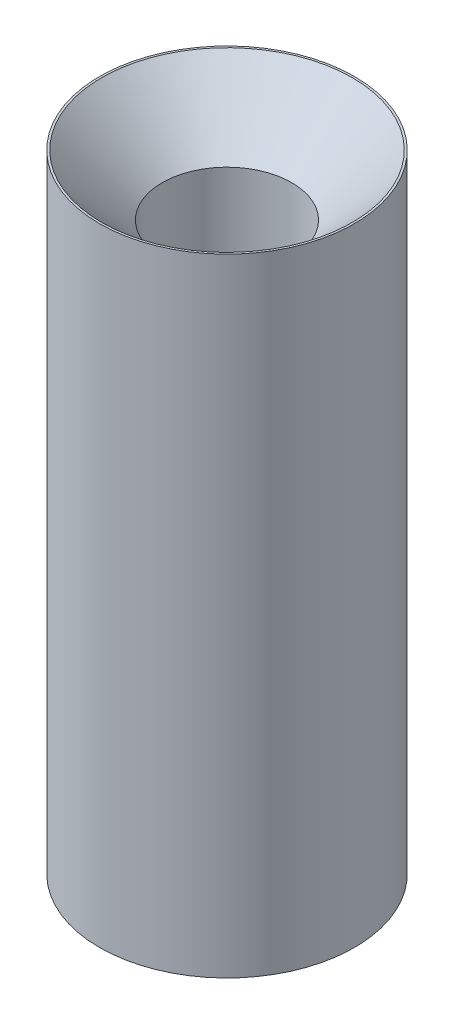
ISO-10303-21;
HEADER;
FILE_DESCRIPTION(('STEP AP214'),'2;1');
FILE_NAME('part.step','',(''),(''),'','','');
FILE_SCHEMA(('AUTOMOTIVE_DESIGN { 1 0 10303 214 1 1 1 1 }'));
ENDSEC;
DATA;
#1=APPLICATION_CONTEXT('core data for automotive mechanical design processes');
#2=APPLICATION_PROTOCOL_DEFINITION('international standard','automotive_design',2000,#1);
#3=PRODUCT_CONTEXT('',#1,'mechanical');
#4=PRODUCT('Part','Part','',(#3));
#5=PRODUCT_RELATED_PRODUCT_CATEGORY('part','',(#4));
#6=PRODUCT_DEFINITION_FORMATION('','',#4);
#7=PRODUCT_DEFINITION_CONTEXT('part definition',#1,'design');
#8=PRODUCT_DEFINITION('design','',#6,#7);
#9=PRODUCT_DEFINITION_SHAPE('','',#8);
#10=(LENGTH_UNIT() NAMED_UNIT(*) SI_UNIT(.MILLI.,.METRE.));
#11=(NAMED_UNIT(*) PLANE_ANGLE_UNIT() SI_UNIT($,.RADIAN.));
#12=(NAMED_UNIT(*) SI_UNIT($,.STERADIAN.) SOLID_ANGLE_UNIT());
#13=UNCERTAINTY_MEASURE_WITH_UNIT(LENGTH_MEASURE(1.E-05),#10,'distance_accuracy_value','');
#14=(GEOMETRIC_REPRESENTATION_CONTEXT(3) GLOBAL_UNCERTAINTY_ASSIGNED_CONTEXT((#13)) GLOBAL_UNIT_ASSIGNED_CONTEXT((#10,
#11,#12)) REPRESENTATION_CONTEXT('',''));
#15=CARTESIAN_POINT('',(0.,0.,0.));
#16=DIRECTION('',(0.,0.,1.));
#17=DIRECTION('',(1.,0.,0.));
#18=AXIS2_PLACEMENT_3D('',#15,#16,#17);
#19=CARTESIAN_POINT('',(0.,15.,0.));
#20=DIRECTION('',(0.,-1.,0.));
#21=DIRECTION('',(0.,0.,-1.));
#22=AXIS2_PLACEMENT_3D('',#19,#20,#21);
#23=CYLINDRICAL_SURFACE('',#22,3.05);
#24=CARTESIAN_POINT('',(0.,15.,0.));
#25=DIRECTION('',(0.,1.,0.));
#26=DIRECTION('',(0.,0.,1.));
#27=AXIS2_PLACEMENT_3D('',#24,#25,#26);
#28=CIRCLE('',#27,3.05);
#29=CARTESIAN_POINT('',(0.,15.,3.05));
#30=VERTEX_POINT('',#29);
#31=EDGE_CURVE('E10',#30,#30,#28,.T.);
#32=ORIENTED_EDGE('',*,*,#31,.F.);
#33=EDGE_LOOP('',(#32));
#34=FACE_BOUND('',#33,.T.);
#35=CARTESIAN_POINT('',(0.,0.,0.));
#36=DIRECTION('',(0.,1.,0.));
#37=DIRECTION('',(0.,0.,1.));
#38=AXIS2_PLACEMENT_3D('',#35,#36,#37);
#39=CIRCLE('',#38,3.05);
#40=CARTESIAN_POINT('',(0.,0.,3.05));
#41=VERTEX_POINT('',#40);
#42=EDGE_CURVE('E44',#41,#41,#39,.T.);
#43=ORIENTED_EDGE('',*,*,#42,.T.);
#44=EDGE_LOOP('',(#43));
#45=FACE_BOUND('',#44,.T.);
#46=ADVANCED_FACE('F37',(#34,#45),#23,.T.);
#47=CARTESIAN_POINT('',(0.,15.,0.));
#48=DIRECTION('',(0.,1.,0.));
#49=DIRECTION('',(0.,0.,1.));
#50=AXIS2_PLACEMENT_3D('',#47,#48,#49);
#51=PLANE('',#50);
#52=CARTESIAN_POINT('',(0.,15.,0.));
#53=DIRECTION('',(0.,1.,0.));
#54=DIRECTION('',(0.,0.,1.));
#55=AXIS2_PLACEMENT_3D('',#52,#53,#54);
#56=CIRCLE('',#55,3.);
#57=CARTESIAN_POINT('',(0.,15.,3.));
#58=VERTEX_POINT('',#57);
#59=EDGE_CURVE('E53',#58,#58,#56,.T.);
#60=ORIENTED_EDGE('',*,*,#59,.F.);
#61=EDGE_LOOP('',(#60));
#62=FACE_BOUND('',#61,.T.);
#63=ORIENTED_EDGE('',*,*,#31,.T.);
#64=EDGE_LOOP('',(#63));
#65=FACE_BOUND('',#64,.T.);
#66=ADVANCED_FACE('F59',(#62,#65),#51,.T.);
#67=CARTESIAN_POINT('',(0.,0.,0.));
#68=DIRECTION('',(0.,1.,0.));
#69=DIRECTION('',(0.,0.,1.));
#70=AXIS2_PLACEMENT_3D('',#67,#68,#69);
#71=PLANE('',#70);
#72=CARTESIAN_POINT('',(0.,0.,0.));
#73=DIRECTION('',(0.,1.,0.));
#74=DIRECTION('',(0.,0.,1.));
#75=AXIS2_PLACEMENT_3D('',#72,#73,#74);
#76=CIRCLE('',#75,1.54999999999999);
#77=CARTESIAN_POINT('',(0.,0.,1.54999999999999));
#78=VERTEX_POINT('',#77);
#79=EDGE_CURVE('E40',#78,#78,#76,.T.);
#80=ORIENTED_EDGE('',*,*,#79,.T.);
#81=EDGE_LOOP('',(#80));
#82=FACE_BOUND('',#81,.T.);
#83=ORIENTED_EDGE('',*,*,#42,.F.);
#84=EDGE_LOOP('',(#83));
#85=FACE_BOUND('',#84,.T.);
#86=ADVANCED_FACE('F61',(#82,#85),#71,.F.);
#87=CARTESIAN_POINT('',(0.,15.,0.));
#88=DIRECTION('',(0.,1.,0.));
#89=DIRECTION('',(0.,0.,1.));
#90=AXIS2_PLACEMENT_3D('',#87,#88,#89);
#91=CYLINDRICAL_SURFACE('',#90,1.54999999999999);
#92=CARTESIAN_POINT('',(0.,13.55,0.));
#93=DIRECTION('',(0.,1.,0.));
#94=DIRECTION('',(0.,0.,1.));
#95=AXIS2_PLACEMENT_3D('',#92,#93,#94);
#96=CIRCLE('',#95,1.54999999999999);
#97=CARTESIAN_POINT('',(0.,13.55,1.54999999999999));
#98=VERTEX_POINT('',#97);
#99=EDGE_CURVE('E50',#98,#98,#96,.T.);
#100=ORIENTED_EDGE('',*,*,#99,.T.);
#101=EDGE_LOOP('',(#100));
#102=FACE_BOUND('',#101,.T.);
#103=ORIENTED_EDGE('',*,*,#79,.F.);
#104=EDGE_LOOP('',(#103));
#105=FACE_BOUND('',#104,.T.);
#106=ADVANCED_FACE('F67',(#102,#105),#91,.F.);
#107=CARTESIAN_POINT('',(0.,15.,0.));
#108=DIRECTION('',(0.,1.,0.));
#109=DIRECTION('',(0.,0.,1.));
#110=AXIS2_PLACEMENT_3D('',#107,#108,#109);
#111=CONICAL_SURFACE('',#110,3.,0.785398163397451);
#112=ORIENTED_EDGE('',*,*,#99,.F.);
#113=EDGE_LOOP('',(#112));
#114=FACE_BOUND('',#113,.T.);
#115=ORIENTED_EDGE('',*,*,#59,.T.);
#116=EDGE_LOOP('',(#115));
#117=FACE_BOUND('',#116,.T.);
#118=ADVANCED_FACE('F57',(#114,#117),#111,.F.);
#119=CLOSED_SHELL('',(#46,#66,#86,#106,#118));
#120=MANIFOLD_SOLID_BREP('B2',#119);
#121=ADVANCED_BREP_SHAPE_REPRESENTATION('',(#18,#120),#14);
#122=SHAPE_DEFINITION_REPRESENTATION(#9,#121);
ENDSEC;
END-ISO-10303-21;
